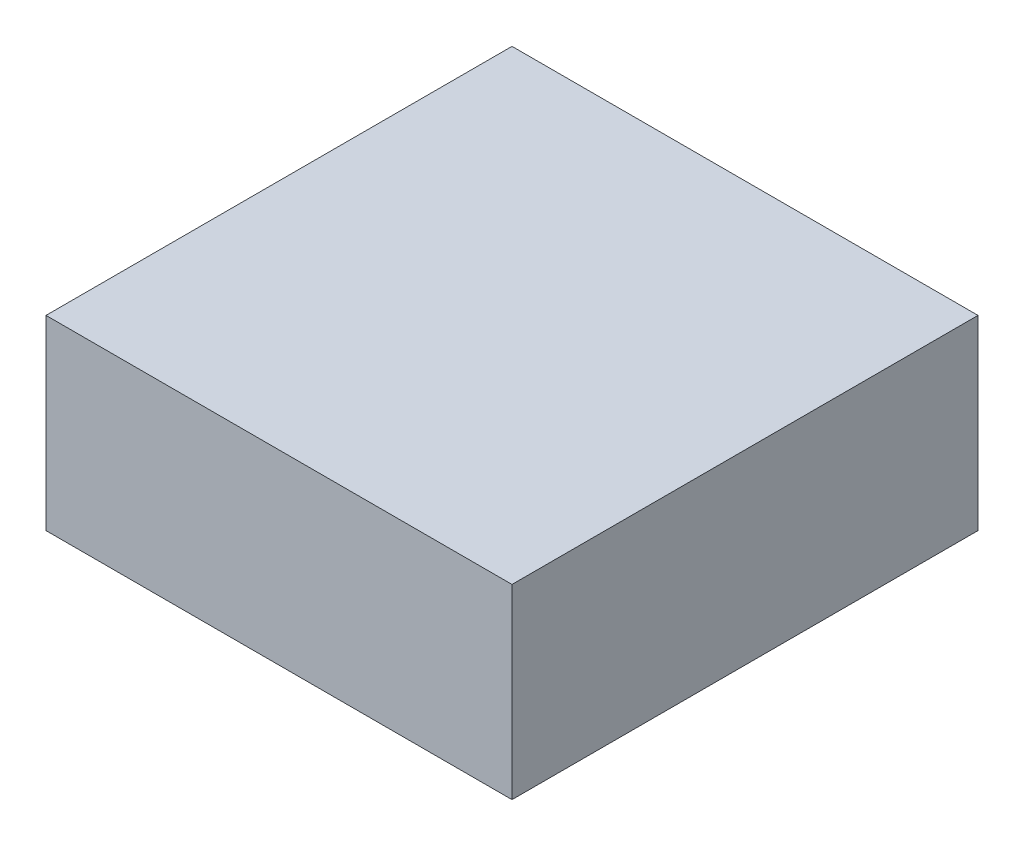
ISO-10303-21;
HEADER;
FILE_DESCRIPTION(('STEP AP214'),'2;1');
FILE_NAME('part.step','',(''),(''),'','','');
FILE_SCHEMA(('AUTOMOTIVE_DESIGN { 1 0 10303 214 1 1 1 1 }'));
ENDSEC;
DATA;
#1=APPLICATION_CONTEXT('core data for automotive mechanical design processes');
#2=APPLICATION_PROTOCOL_DEFINITION('international standard','automotive_design',2000,#1);
#3=PRODUCT_CONTEXT('',#1,'mechanical');
#4=PRODUCT('Part','Part','',(#3));
#5=PRODUCT_RELATED_PRODUCT_CATEGORY('part','',(#4));
#6=PRODUCT_DEFINITION_FORMATION('','',#4);
#7=PRODUCT_DEFINITION_CONTEXT('part definition',#1,'design');
#8=PRODUCT_DEFINITION('design','',#6,#7);
#9=PRODUCT_DEFINITION_SHAPE('','',#8);
#10=(LENGTH_UNIT() NAMED_UNIT(*) SI_UNIT(.MILLI.,.METRE.));
#11=(NAMED_UNIT(*) PLANE_ANGLE_UNIT() SI_UNIT($,.RADIAN.));
#12=(NAMED_UNIT(*) SI_UNIT($,.STERADIAN.) SOLID_ANGLE_UNIT());
#13=UNCERTAINTY_MEASURE_WITH_UNIT(LENGTH_MEASURE(1.E-05),#10,'distance_accuracy_value','');
#14=(GEOMETRIC_REPRESENTATION_CONTEXT(3) GLOBAL_UNCERTAINTY_ASSIGNED_CONTEXT((#13)) GLOBAL_UNIT_ASSIGNED_CONTEXT((#10,
#11,#12)) REPRESENTATION_CONTEXT('',''));
#15=CARTESIAN_POINT('',(0.,0.,0.));
#16=DIRECTION('',(0.,0.,1.));
#17=DIRECTION('',(1.,0.,0.));
#18=AXIS2_PLACEMENT_3D('',#15,#16,#17);
#19=CARTESIAN_POINT('',(62.4999999999999,50.,-62.5));
#20=DIRECTION('',(-1.,0.,0.));
#21=DIRECTION('',(0.,0.,1.));
#22=AXIS2_PLACEMENT_3D('',#19,#20,#21);
#23=PLANE('',#22);
#24=DIRECTION('',(0.,0.,-1.));
#25=VECTOR('',#24,1.);
#26=CARTESIAN_POINT('',(62.4999999999999,0.,-62.5));
#27=LINE('',#26,#25);
#28=CARTESIAN_POINT('',(62.5,0.,62.5));
#29=VERTEX_POINT('',#28);
#30=CARTESIAN_POINT('',(62.4999999999999,0.,-62.5));
#31=VERTEX_POINT('',#30);
#32=EDGE_CURVE('E98',#29,#31,#27,.T.);
#33=ORIENTED_EDGE('',*,*,#32,.T.);
#34=DIRECTION('',(0.,-1.,0.));
#35=VECTOR('',#34,1.);
#36=CARTESIAN_POINT('',(62.4999999999999,50.,-62.5));
#37=LINE('',#36,#35);
#38=CARTESIAN_POINT('',(62.4999999999999,50.,-62.5));
#39=VERTEX_POINT('',#38);
#40=EDGE_CURVE('E11',#39,#31,#37,.T.);
#41=ORIENTED_EDGE('',*,*,#40,.F.);
#42=DIRECTION('',(0.,0.,-1.));
#43=VECTOR('',#42,1.);
#44=CARTESIAN_POINT('',(62.4999999999999,50.,-62.5));
#45=LINE('',#44,#43);
#46=CARTESIAN_POINT('',(62.5,50.,62.5));
#47=VERTEX_POINT('',#46);
#48=EDGE_CURVE('E86',#47,#39,#45,.T.);
#49=ORIENTED_EDGE('',*,*,#48,.F.);
#50=DIRECTION('',(0.,-1.,0.));
#51=VECTOR('',#50,1.);
#52=CARTESIAN_POINT('',(62.5,50.,62.5));
#53=LINE('',#52,#51);
#54=EDGE_CURVE('E94',#47,#29,#53,.T.);
#55=ORIENTED_EDGE('',*,*,#54,.T.);
#56=EDGE_LOOP('',(#33,#41,#49,#55));
#57=FACE_BOUND('',#56,.T.);
#58=ADVANCED_FACE('F35',(#57),#23,.F.);
#59=CARTESIAN_POINT('',(-62.5,50.,-62.5));
#60=DIRECTION('',(0.,0.,1.));
#61=DIRECTION('',(1.,0.,0.));
#62=AXIS2_PLACEMENT_3D('',#59,#60,#61);
#63=PLANE('',#62);
#64=DIRECTION('',(-1.,0.,0.));
#65=VECTOR('',#64,1.);
#66=CARTESIAN_POINT('',(-62.5,0.,-62.5));
#67=LINE('',#66,#65);
#68=CARTESIAN_POINT('',(-62.5,0.,-62.5));
#69=VERTEX_POINT('',#68);
#70=EDGE_CURVE('E90',#31,#69,#67,.T.);
#71=ORIENTED_EDGE('',*,*,#70,.T.);
#72=DIRECTION('',(0.,-1.,0.));
#73=VECTOR('',#72,1.);
#74=CARTESIAN_POINT('',(-62.5,50.,-62.5));
#75=LINE('',#74,#73);
#76=CARTESIAN_POINT('',(-62.5,50.,-62.5));
#77=VERTEX_POINT('',#76);
#78=EDGE_CURVE('E43',#77,#69,#75,.T.);
#79=ORIENTED_EDGE('',*,*,#78,.F.);
#80=DIRECTION('',(-1.,0.,0.));
#81=VECTOR('',#80,1.);
#82=CARTESIAN_POINT('',(-62.5,50.,-62.5));
#83=LINE('',#82,#81);
#84=EDGE_CURVE('E81',#39,#77,#83,.T.);
#85=ORIENTED_EDGE('',*,*,#84,.F.);
#86=ORIENTED_EDGE('',*,*,#40,.T.);
#87=EDGE_LOOP('',(#71,#79,#85,#86));
#88=FACE_BOUND('',#87,.T.);
#89=ADVANCED_FACE('F89',(#88),#63,.F.);
#90=CARTESIAN_POINT('',(-62.5,50.,-62.5));
#91=DIRECTION('',(1.,0.,0.));
#92=DIRECTION('',(0.,0.,-1.));
#93=AXIS2_PLACEMENT_3D('',#90,#91,#92);
#94=PLANE('',#93);
#95=DIRECTION('',(0.,0.,1.));
#96=VECTOR('',#95,1.);
#97=CARTESIAN_POINT('',(-62.5,0.,-62.5));
#98=LINE('',#97,#96);
#99=CARTESIAN_POINT('',(-62.5,0.,62.5));
#100=VERTEX_POINT('',#99);
#101=EDGE_CURVE('E68',#69,#100,#98,.T.);
#102=ORIENTED_EDGE('',*,*,#101,.T.);
#103=DIRECTION('',(0.,-1.,0.));
#104=VECTOR('',#103,1.);
#105=CARTESIAN_POINT('',(-62.5,50.,62.5));
#106=LINE('',#105,#104);
#107=CARTESIAN_POINT('',(-62.5,50.,62.5));
#108=VERTEX_POINT('',#107);
#109=EDGE_CURVE('E91',#108,#100,#106,.T.);
#110=ORIENTED_EDGE('',*,*,#109,.F.);
#111=DIRECTION('',(0.,0.,1.));
#112=VECTOR('',#111,1.);
#113=CARTESIAN_POINT('',(-62.5,50.,-62.5));
#114=LINE('',#113,#112);
#115=EDGE_CURVE('E84',#77,#108,#114,.T.);
#116=ORIENTED_EDGE('',*,*,#115,.F.);
#117=ORIENTED_EDGE('',*,*,#78,.T.);
#118=EDGE_LOOP('',(#102,#110,#116,#117));
#119=FACE_BOUND('',#118,.T.);
#120=ADVANCED_FACE('F92',(#119),#94,.F.);
#121=CARTESIAN_POINT('',(-62.5,50.,62.5));
#122=DIRECTION('',(0.,0.,-1.));
#123=DIRECTION('',(-1.,0.,0.));
#124=AXIS2_PLACEMENT_3D('',#121,#122,#123);
#125=PLANE('',#124);
#126=DIRECTION('',(1.,0.,0.));
#127=VECTOR('',#126,1.);
#128=CARTESIAN_POINT('',(-62.5,0.,62.5));
#129=LINE('',#128,#127);
#130=EDGE_CURVE('E74',#100,#29,#129,.T.);
#131=ORIENTED_EDGE('',*,*,#130,.T.);
#132=ORIENTED_EDGE('',*,*,#54,.F.);
#133=DIRECTION('',(1.,0.,0.));
#134=VECTOR('',#133,1.);
#135=CARTESIAN_POINT('',(-62.5,50.,62.5));
#136=LINE('',#135,#134);
#137=EDGE_CURVE('E51',#108,#47,#136,.T.);
#138=ORIENTED_EDGE('',*,*,#137,.F.);
#139=ORIENTED_EDGE('',*,*,#109,.T.);
#140=EDGE_LOOP('',(#131,#132,#138,#139));
#141=FACE_BOUND('',#140,.T.);
#142=ADVANCED_FACE('F105',(#141),#125,.F.);
#143=CARTESIAN_POINT('',(0.,50.,0.));
#144=DIRECTION('',(0.,1.,0.));
#145=DIRECTION('',(0.,0.,1.));
#146=AXIS2_PLACEMENT_3D('',#143,#144,#145);
#147=PLANE('',#146);
#148=ORIENTED_EDGE('',*,*,#48,.T.);
#149=ORIENTED_EDGE('',*,*,#84,.T.);
#150=ORIENTED_EDGE('',*,*,#115,.T.);
#151=ORIENTED_EDGE('',*,*,#137,.T.);
#152=EDGE_LOOP('',(#148,#149,#150,#151));
#153=FACE_BOUND('',#152,.T.);
#154=ADVANCED_FACE('F82',(#153),#147,.T.);
#155=CARTESIAN_POINT('',(0.,0.,0.));
#156=DIRECTION('',(0.,1.,0.));
#157=DIRECTION('',(0.,0.,1.));
#158=AXIS2_PLACEMENT_3D('',#155,#156,#157);
#159=PLANE('',#158);
#160=ORIENTED_EDGE('',*,*,#32,.F.);
#161=ORIENTED_EDGE('',*,*,#130,.F.);
#162=ORIENTED_EDGE('',*,*,#101,.F.);
#163=ORIENTED_EDGE('',*,*,#70,.F.);
#164=EDGE_LOOP('',(#160,#161,#162,#163));
#165=FACE_BOUND('',#164,.T.);
#166=ADVANCED_FACE('F108',(#165),#159,.F.);
#167=CLOSED_SHELL('',(#58,#89,#120,#142,#154,#166));
#168=MANIFOLD_SOLID_BREP('B2',#167);
#169=ADVANCED_BREP_SHAPE_REPRESENTATION('',(#18,#168),#14);
#170=SHAPE_DEFINITION_REPRESENTATION(#9,#169);
ENDSEC;
END-ISO-10303-21;
